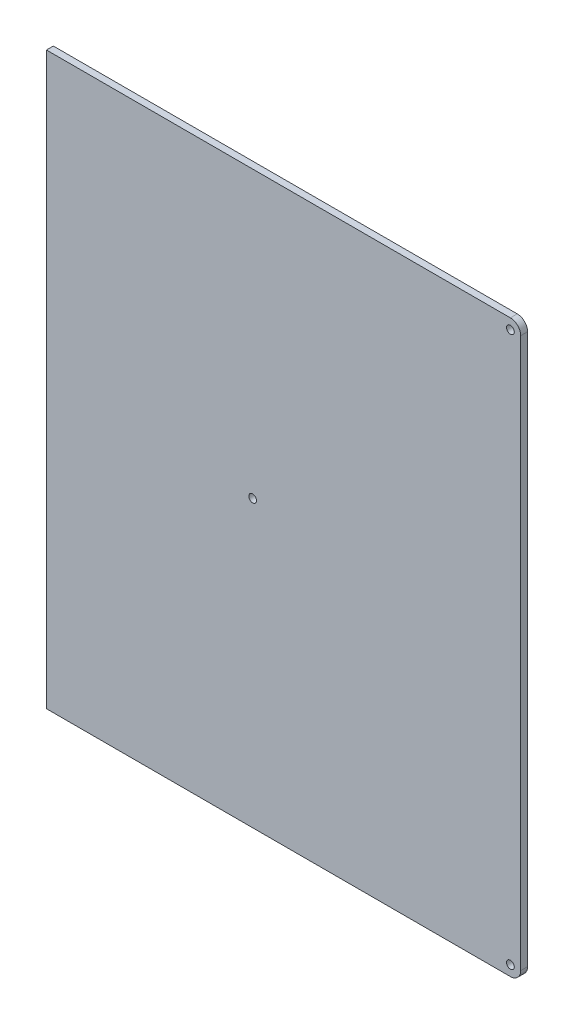
ISO-10303-21;
HEADER;
FILE_DESCRIPTION(('STEP AP214'),'2;1');
FILE_NAME('part.step','',(''),(''),'','','');
FILE_SCHEMA(('AUTOMOTIVE_DESIGN { 1 0 10303 214 1 1 1 1 }'));
ENDSEC;
DATA;
#1=APPLICATION_CONTEXT('core data for automotive mechanical design processes');
#2=APPLICATION_PROTOCOL_DEFINITION('international standard','automotive_design',2000,#1);
#3=PRODUCT_CONTEXT('',#1,'mechanical');
#4=PRODUCT('Part','Part','',(#3));
#5=PRODUCT_RELATED_PRODUCT_CATEGORY('part','',(#4));
#6=PRODUCT_DEFINITION_FORMATION('','',#4);
#7=PRODUCT_DEFINITION_CONTEXT('part definition',#1,'design');
#8=PRODUCT_DEFINITION('design','',#6,#7);
#9=PRODUCT_DEFINITION_SHAPE('','',#8);
#10=(LENGTH_UNIT() NAMED_UNIT(*) SI_UNIT(.MILLI.,.METRE.));
#11=(NAMED_UNIT(*) PLANE_ANGLE_UNIT() SI_UNIT($,.RADIAN.));
#12=(NAMED_UNIT(*) SI_UNIT($,.STERADIAN.) SOLID_ANGLE_UNIT());
#13=UNCERTAINTY_MEASURE_WITH_UNIT(LENGTH_MEASURE(1.E-05),#10,'distance_accuracy_value','');
#14=(GEOMETRIC_REPRESENTATION_CONTEXT(3) GLOBAL_UNCERTAINTY_ASSIGNED_CONTEXT((#13)) GLOBAL_UNIT_ASSIGNED_CONTEXT((#10,
#11,#12)) REPRESENTATION_CONTEXT('',''));
#15=CARTESIAN_POINT('',(0.,0.,0.));
#16=DIRECTION('',(0.,0.,1.));
#17=DIRECTION('',(1.,0.,0.));
#18=AXIS2_PLACEMENT_3D('',#15,#16,#17);
#19=CARTESIAN_POINT('',(0.,-83.,2.99));
#20=DIRECTION('',(1.,0.,0.));
#21=DIRECTION('',(0.,1.,0.));
#22=AXIS2_PLACEMENT_3D('',#19,#20,#21);
#23=PLANE('',#22);
#24=DIRECTION('',(0.,-1.,0.));
#25=VECTOR('',#24,1.);
#26=CARTESIAN_POINT('',(0.,-80.,3.));
#27=LINE('',#26,#25);
#28=CARTESIAN_POINT('',(0.,83.,3.));
#29=VERTEX_POINT('',#28);
#30=CARTESIAN_POINT('',(0.,-83.,3.));
#31=VERTEX_POINT('',#30);
#32=EDGE_CURVE('E11',#29,#31,#27,.T.);
#33=ORIENTED_EDGE('',*,*,#32,.T.);
#34=DIRECTION('',(0.,0.,-1.));
#35=VECTOR('',#34,1.);
#36=CARTESIAN_POINT('',(0.,-83.,5.));
#37=LINE('',#36,#35);
#38=CARTESIAN_POINT('',(0.,-83.,5.));
#39=VERTEX_POINT('',#38);
#40=EDGE_CURVE('E66',#39,#31,#37,.T.);
#41=ORIENTED_EDGE('',*,*,#40,.F.);
#42=DIRECTION('',(0.,1.,0.));
#43=VECTOR('',#42,1.);
#44=CARTESIAN_POINT('',(0.,0.,5.));
#45=LINE('',#44,#43);
#46=CARTESIAN_POINT('',(0.,83.,5.));
#47=VERTEX_POINT('',#46);
#48=EDGE_CURVE('E52',#39,#47,#45,.T.);
#49=ORIENTED_EDGE('',*,*,#48,.T.);
#50=DIRECTION('',(0.,0.,1.));
#51=VECTOR('',#50,1.);
#52=CARTESIAN_POINT('',(0.,83.,5.));
#53=LINE('',#52,#51);
#54=EDGE_CURVE('E47',#29,#47,#53,.T.);
#55=ORIENTED_EDGE('',*,*,#54,.F.);
#56=EDGE_LOOP('',(#33,#41,#49,#55));
#57=FACE_BOUND('',#56,.T.);
#58=ADVANCED_FACE('F44',(#57),#23,.F.);
#59=CARTESIAN_POINT('',(138.,83.,5.));
#60=DIRECTION('',(-1.,0.,0.));
#61=DIRECTION('',(0.,0.,1.));
#62=AXIS2_PLACEMENT_3D('',#59,#60,#61);
#63=PLANE('',#62);
#64=DIRECTION('',(0.,-1.,0.));
#65=VECTOR('',#64,1.);
#66=CARTESIAN_POINT('',(138.,80.,3.));
#67=LINE('',#66,#65);
#68=CARTESIAN_POINT('',(138.,80.,3.));
#69=VERTEX_POINT('',#68);
#70=CARTESIAN_POINT('',(138.,-80.,3.));
#71=VERTEX_POINT('',#70);
#72=EDGE_CURVE('E114',#69,#71,#67,.T.);
#73=ORIENTED_EDGE('',*,*,#72,.F.);
#74=DIRECTION('',(0.,0.,-1.));
#75=VECTOR('',#74,1.);
#76=CARTESIAN_POINT('',(138.,80.,5.));
#77=LINE('',#76,#75);
#78=CARTESIAN_POINT('',(138.,80.,5.));
#79=VERTEX_POINT('',#78);
#80=EDGE_CURVE('E113',#69,#79,#77,.F.);
#81=ORIENTED_EDGE('',*,*,#80,.T.);
#82=DIRECTION('',(0.,1.,0.));
#83=VECTOR('',#82,1.);
#84=CARTESIAN_POINT('',(138.,83.,5.));
#85=LINE('',#84,#83);
#86=CARTESIAN_POINT('',(138.,-80.,5.));
#87=VERTEX_POINT('',#86);
#88=EDGE_CURVE('E140',#87,#79,#85,.T.);
#89=ORIENTED_EDGE('',*,*,#88,.F.);
#90=DIRECTION('',(0.,0.,-1.));
#91=VECTOR('',#90,1.);
#92=CARTESIAN_POINT('',(138.,-80.,5.));
#93=LINE('',#92,#91);
#94=EDGE_CURVE('E129',#87,#71,#93,.T.);
#95=ORIENTED_EDGE('',*,*,#94,.T.);
#96=EDGE_LOOP('',(#73,#81,#89,#95));
#97=FACE_BOUND('',#96,.T.);
#98=ADVANCED_FACE('F173',(#97),#63,.F.);
#99=CARTESIAN_POINT('',(-138.,83.,5.));
#100=DIRECTION('',(0.,-1.,0.));
#101=DIRECTION('',(0.,0.,-1.));
#102=AXIS2_PLACEMENT_3D('',#99,#100,#101);
#103=PLANE('',#102);
#104=DIRECTION('',(1.,0.,0.));
#105=VECTOR('',#104,1.);
#106=CARTESIAN_POINT('',(-135.,83.,3.));
#107=LINE('',#106,#105);
#108=CARTESIAN_POINT('',(135.,83.,3.));
#109=VERTEX_POINT('',#108);
#110=EDGE_CURVE('E97',#29,#109,#107,.T.);
#111=ORIENTED_EDGE('',*,*,#110,.F.);
#112=ORIENTED_EDGE('',*,*,#54,.T.);
#113=DIRECTION('',(-1.,0.,0.));
#114=VECTOR('',#113,1.);
#115=CARTESIAN_POINT('',(-138.,83.,5.));
#116=LINE('',#115,#114);
#117=CARTESIAN_POINT('',(135.,83.,5.));
#118=VERTEX_POINT('',#117);
#119=EDGE_CURVE('E119',#118,#47,#116,.T.);
#120=ORIENTED_EDGE('',*,*,#119,.F.);
#121=DIRECTION('',(0.,0.,-1.));
#122=VECTOR('',#121,1.);
#123=CARTESIAN_POINT('',(135.,83.,5.));
#124=LINE('',#123,#122);
#125=EDGE_CURVE('E112',#118,#109,#124,.T.);
#126=ORIENTED_EDGE('',*,*,#125,.T.);
#127=EDGE_LOOP('',(#111,#112,#120,#126));
#128=FACE_BOUND('',#127,.T.);
#129=ADVANCED_FACE('F117',(#128),#103,.F.);
#130=CARTESIAN_POINT('',(-138.,-83.,5.));
#131=DIRECTION('',(0.,1.,0.));
#132=DIRECTION('',(0.,0.,1.));
#133=AXIS2_PLACEMENT_3D('',#130,#131,#132);
#134=PLANE('',#133);
#135=DIRECTION('',(1.,0.,0.));
#136=VECTOR('',#135,1.);
#137=CARTESIAN_POINT('',(-138.,-83.,5.));
#138=LINE('',#137,#136);
#139=CARTESIAN_POINT('',(135.,-83.,5.));
#140=VERTEX_POINT('',#139);
#141=EDGE_CURVE('E121',#39,#140,#138,.T.);
#142=ORIENTED_EDGE('',*,*,#141,.F.);
#143=ORIENTED_EDGE('',*,*,#40,.T.);
#144=DIRECTION('',(-1.,0.,0.));
#145=VECTOR('',#144,1.);
#146=CARTESIAN_POINT('',(135.,-83.,3.));
#147=LINE('',#146,#145);
#148=CARTESIAN_POINT('',(135.,-83.,3.));
#149=VERTEX_POINT('',#148);
#150=EDGE_CURVE('E161',#149,#31,#147,.T.);
#151=ORIENTED_EDGE('',*,*,#150,.F.);
#152=DIRECTION('',(0.,0.,-1.));
#153=VECTOR('',#152,1.);
#154=CARTESIAN_POINT('',(135.,-83.,5.));
#155=LINE('',#154,#153);
#156=EDGE_CURVE('E133',#149,#140,#155,.F.);
#157=ORIENTED_EDGE('',*,*,#156,.T.);
#158=EDGE_LOOP('',(#142,#143,#151,#157));
#159=FACE_BOUND('',#158,.T.);
#160=ADVANCED_FACE('F174',(#159),#134,.F.);
#161=CARTESIAN_POINT('',(135.000000000002,-80.,5.));
#162=DIRECTION('',(0.,0.,1.));
#163=DIRECTION('',(1.,0.,0.));
#164=AXIS2_PLACEMENT_3D('',#161,#162,#163);
#165=CYLINDRICAL_SURFACE('',#164,1.13029999999997);
#166=CARTESIAN_POINT('',(135.000000000002,-80.,5.));
#167=DIRECTION('',(0.,0.,1.));
#168=DIRECTION('',(1.,0.,0.));
#169=AXIS2_PLACEMENT_3D('',#166,#167,#168);
#170=CIRCLE('',#169,1.13029999999997);
#171=CARTESIAN_POINT('',(136.130300000002,-80.,5.));
#172=VERTEX_POINT('',#171);
#173=EDGE_CURVE('E141',#172,#172,#170,.T.);
#174=ORIENTED_EDGE('',*,*,#173,.T.);
#175=EDGE_LOOP('',(#174));
#176=FACE_BOUND('',#175,.T.);
#177=CARTESIAN_POINT('',(135.000000000002,-80.,3.));
#178=DIRECTION('',(0.,0.,-1.));
#179=DIRECTION('',(-1.,0.,0.));
#180=AXIS2_PLACEMENT_3D('',#177,#178,#179);
#181=CIRCLE('',#180,1.13029999999997);
#182=CARTESIAN_POINT('',(133.869700000002,-80.,3.));
#183=VERTEX_POINT('',#182);
#184=EDGE_CURVE('E152',#183,#183,#181,.F.);
#185=ORIENTED_EDGE('',*,*,#184,.F.);
#186=EDGE_LOOP('',(#185));
#187=FACE_BOUND('',#186,.T.);
#188=ADVANCED_FACE('F176',(#176,#187),#165,.F.);
#189=CARTESIAN_POINT('',(135.,80.,5.));
#190=DIRECTION('',(0.,0.,1.));
#191=DIRECTION('',(1.,0.,0.));
#192=AXIS2_PLACEMENT_3D('',#189,#190,#191);
#193=CYLINDRICAL_SURFACE('',#192,1.13029999999997);
#194=CARTESIAN_POINT('',(135.,80.,5.));
#195=DIRECTION('',(0.,0.,1.));
#196=DIRECTION('',(1.,0.,0.));
#197=AXIS2_PLACEMENT_3D('',#194,#195,#196);
#198=CIRCLE('',#197,1.13029999999997);
#199=CARTESIAN_POINT('',(136.1303,80.,5.));
#200=VERTEX_POINT('',#199);
#201=EDGE_CURVE('E146',#200,#200,#198,.T.);
#202=ORIENTED_EDGE('',*,*,#201,.T.);
#203=EDGE_LOOP('',(#202));
#204=FACE_BOUND('',#203,.T.);
#205=CARTESIAN_POINT('',(135.,80.,3.));
#206=DIRECTION('',(0.,0.,-1.));
#207=DIRECTION('',(-1.,0.,0.));
#208=AXIS2_PLACEMENT_3D('',#205,#206,#207);
#209=CIRCLE('',#208,1.13029999999997);
#210=CARTESIAN_POINT('',(133.8697,80.,3.));
#211=VERTEX_POINT('',#210);
#212=EDGE_CURVE('E155',#211,#211,#209,.F.);
#213=ORIENTED_EDGE('',*,*,#212,.F.);
#214=EDGE_LOOP('',(#213));
#215=FACE_BOUND('',#214,.T.);
#216=ADVANCED_FACE('F184',(#204,#215),#193,.F.);
#217=CARTESIAN_POINT('',(135.,80.,5.));
#218=DIRECTION('',(0.,0.,-1.));
#219=DIRECTION('',(-1.,0.,0.));
#220=AXIS2_PLACEMENT_3D('',#217,#218,#219);
#221=CYLINDRICAL_SURFACE('',#220,3.);
#222=ORIENTED_EDGE('',*,*,#80,.F.);
#223=CARTESIAN_POINT('',(135.,80.,3.));
#224=DIRECTION('',(0.,0.,-1.));
#225=DIRECTION('',(-1.,0.,0.));
#226=AXIS2_PLACEMENT_3D('',#223,#224,#225);
#227=CIRCLE('',#226,3.);
#228=EDGE_CURVE('E101',#109,#69,#227,.T.);
#229=ORIENTED_EDGE('',*,*,#228,.F.);
#230=ORIENTED_EDGE('',*,*,#125,.F.);
#231=CARTESIAN_POINT('',(135.,80.,5.));
#232=DIRECTION('',(0.,0.,1.));
#233=DIRECTION('',(1.,0.,0.));
#234=AXIS2_PLACEMENT_3D('',#231,#232,#233);
#235=CIRCLE('',#234,3.);
#236=EDGE_CURVE('E123',#79,#118,#235,.T.);
#237=ORIENTED_EDGE('',*,*,#236,.F.);
#238=EDGE_LOOP('',(#222,#229,#230,#237));
#239=FACE_BOUND('',#238,.T.);
#240=ADVANCED_FACE('F110',(#239),#221,.T.);
#241=CARTESIAN_POINT('',(135.,-80.,5.));
#242=DIRECTION('',(0.,0.,-1.));
#243=DIRECTION('',(-1.,0.,0.));
#244=AXIS2_PLACEMENT_3D('',#241,#242,#243);
#245=CYLINDRICAL_SURFACE('',#244,3.);
#246=ORIENTED_EDGE('',*,*,#156,.F.);
#247=CARTESIAN_POINT('',(135.,-80.,3.));
#248=DIRECTION('',(0.,0.,-1.));
#249=DIRECTION('',(-1.,0.,0.));
#250=AXIS2_PLACEMENT_3D('',#247,#248,#249);
#251=CIRCLE('',#250,3.);
#252=EDGE_CURVE('E163',#71,#149,#251,.T.);
#253=ORIENTED_EDGE('',*,*,#252,.F.);
#254=ORIENTED_EDGE('',*,*,#94,.F.);
#255=CARTESIAN_POINT('',(135.,-80.,5.));
#256=DIRECTION('',(0.,0.,1.));
#257=DIRECTION('',(1.,0.,0.));
#258=AXIS2_PLACEMENT_3D('',#255,#256,#257);
#259=CIRCLE('',#258,3.);
#260=EDGE_CURVE('E120',#140,#87,#259,.T.);
#261=ORIENTED_EDGE('',*,*,#260,.F.);
#262=EDGE_LOOP('',(#246,#253,#254,#261));
#263=FACE_BOUND('',#262,.T.);
#264=ADVANCED_FACE('F170',(#263),#245,.T.);
#265=CARTESIAN_POINT('',(60.,0.,5.));
#266=DIRECTION('',(0.,0.,1.));
#267=DIRECTION('',(1.,0.,0.));
#268=AXIS2_PLACEMENT_3D('',#265,#266,#267);
#269=CYLINDRICAL_SURFACE('',#268,1.13029999999999);
#270=CARTESIAN_POINT('',(60.,0.,5.));
#271=DIRECTION('',(0.,0.,1.));
#272=DIRECTION('',(1.,0.,0.));
#273=AXIS2_PLACEMENT_3D('',#270,#271,#272);
#274=CIRCLE('',#273,1.13029999999999);
#275=CARTESIAN_POINT('',(61.1303,0.,5.));
#276=VERTEX_POINT('',#275);
#277=EDGE_CURVE('E149',#276,#276,#274,.T.);
#278=ORIENTED_EDGE('',*,*,#277,.T.);
#279=EDGE_LOOP('',(#278));
#280=FACE_BOUND('',#279,.T.);
#281=CARTESIAN_POINT('',(60.,0.,3.));
#282=DIRECTION('',(0.,0.,-1.));
#283=DIRECTION('',(-1.,0.,0.));
#284=AXIS2_PLACEMENT_3D('',#281,#282,#283);
#285=CIRCLE('',#284,1.13029999999999);
#286=CARTESIAN_POINT('',(58.8697,0.,3.));
#287=VERTEX_POINT('',#286);
#288=EDGE_CURVE('E158',#287,#287,#285,.F.);
#289=ORIENTED_EDGE('',*,*,#288,.F.);
#290=EDGE_LOOP('',(#289));
#291=FACE_BOUND('',#290,.T.);
#292=ADVANCED_FACE('F202',(#280,#291),#269,.F.);
#293=CARTESIAN_POINT('',(0.,0.,5.));
#294=DIRECTION('',(0.,0.,1.));
#295=DIRECTION('',(1.,0.,0.));
#296=AXIS2_PLACEMENT_3D('',#293,#294,#295);
#297=PLANE('',#296);
#298=ORIENTED_EDGE('',*,*,#48,.F.);
#299=ORIENTED_EDGE('',*,*,#141,.T.);
#300=ORIENTED_EDGE('',*,*,#260,.T.);
#301=ORIENTED_EDGE('',*,*,#88,.T.);
#302=ORIENTED_EDGE('',*,*,#236,.T.);
#303=ORIENTED_EDGE('',*,*,#119,.T.);
#304=EDGE_LOOP('',(#298,#299,#300,#301,#302,#303));
#305=FACE_BOUND('',#304,.T.);
#306=ORIENTED_EDGE('',*,*,#277,.F.);
#307=EDGE_LOOP('',(#306));
#308=FACE_BOUND('',#307,.T.);
#309=ORIENTED_EDGE('',*,*,#201,.F.);
#310=EDGE_LOOP('',(#309));
#311=FACE_BOUND('',#310,.T.);
#312=ORIENTED_EDGE('',*,*,#173,.F.);
#313=EDGE_LOOP('',(#312));
#314=FACE_BOUND('',#313,.T.);
#315=ADVANCED_FACE('F137',(#305,#308,#311,#314),#297,.T.);
#316=CARTESIAN_POINT('',(-135.,-80.,3.));
#317=DIRECTION('',(0.,0.,-1.));
#318=DIRECTION('',(-1.,0.,0.));
#319=AXIS2_PLACEMENT_3D('',#316,#317,#318);
#320=PLANE('',#319);
#321=ORIENTED_EDGE('',*,*,#32,.F.);
#322=ORIENTED_EDGE('',*,*,#110,.T.);
#323=ORIENTED_EDGE('',*,*,#228,.T.);
#324=ORIENTED_EDGE('',*,*,#72,.T.);
#325=ORIENTED_EDGE('',*,*,#252,.T.);
#326=ORIENTED_EDGE('',*,*,#150,.T.);
#327=EDGE_LOOP('',(#321,#322,#323,#324,#325,#326));
#328=FACE_BOUND('',#327,.T.);
#329=ORIENTED_EDGE('',*,*,#288,.T.);
#330=EDGE_LOOP('',(#329));
#331=FACE_BOUND('',#330,.T.);
#332=ORIENTED_EDGE('',*,*,#212,.T.);
#333=EDGE_LOOP('',(#332));
#334=FACE_BOUND('',#333,.T.);
#335=ORIENTED_EDGE('',*,*,#184,.T.);
#336=EDGE_LOOP('',(#335));
#337=FACE_BOUND('',#336,.T.);
#338=ADVANCED_FACE('F99',(#328,#331,#334,#337),#320,.T.);
#339=CLOSED_SHELL('',(#58,#98,#129,#160,#188,#216,#240,#264,#292,#315,#338));
#340=MANIFOLD_SOLID_BREP('B2',#339);
#341=ADVANCED_BREP_SHAPE_REPRESENTATION('',(#18,#340),#14);
#342=SHAPE_DEFINITION_REPRESENTATION(#9,#341);
ENDSEC;
END-ISO-10303-21;
